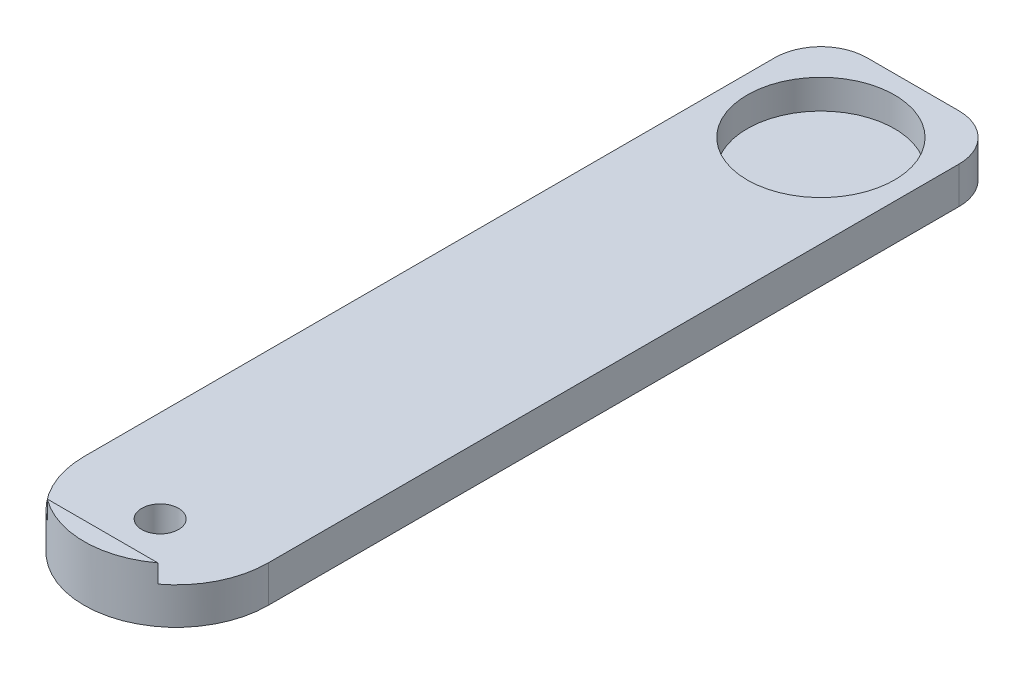
ISO-10303-21;
HEADER;
FILE_DESCRIPTION(('STEP AP214'),'2;1');
FILE_NAME('part.step','',(''),(''),'','','');
FILE_SCHEMA(('AUTOMOTIVE_DESIGN { 1 0 10303 214 1 1 1 1 }'));
ENDSEC;
DATA;
#1=APPLICATION_CONTEXT('core data for automotive mechanical design processes');
#2=APPLICATION_PROTOCOL_DEFINITION('international standard','automotive_design',2000,#1);
#3=PRODUCT_CONTEXT('',#1,'mechanical');
#4=PRODUCT('Part','Part','',(#3));
#5=PRODUCT_RELATED_PRODUCT_CATEGORY('part','',(#4));
#6=PRODUCT_DEFINITION_FORMATION('','',#4);
#7=PRODUCT_DEFINITION_CONTEXT('part definition',#1,'design');
#8=PRODUCT_DEFINITION('design','',#6,#7);
#9=PRODUCT_DEFINITION_SHAPE('','',#8);
#10=(LENGTH_UNIT() NAMED_UNIT(*) SI_UNIT(.MILLI.,.METRE.));
#11=(NAMED_UNIT(*) PLANE_ANGLE_UNIT() SI_UNIT($,.RADIAN.));
#12=(NAMED_UNIT(*) SI_UNIT($,.STERADIAN.) SOLID_ANGLE_UNIT());
#13=UNCERTAINTY_MEASURE_WITH_UNIT(LENGTH_MEASURE(1.E-05),#10,'distance_accuracy_value','');
#14=(GEOMETRIC_REPRESENTATION_CONTEXT(3) GLOBAL_UNCERTAINTY_ASSIGNED_CONTEXT((#13)) GLOBAL_UNIT_ASSIGNED_CONTEXT((#10,
#11,#12)) REPRESENTATION_CONTEXT('',''));
#15=CARTESIAN_POINT('',(0.,0.,0.));
#16=DIRECTION('',(0.,0.,1.));
#17=DIRECTION('',(1.,0.,0.));
#18=AXIS2_PLACEMENT_3D('',#15,#16,#17);
#19=CARTESIAN_POINT('',(0.,4.,0.));
#20=DIRECTION('',(0.,-1.,0.));
#21=DIRECTION('',(0.,0.,-1.));
#22=AXIS2_PLACEMENT_3D('',#19,#20,#21);
#23=PLANE('',#22);
#24=CARTESIAN_POINT('',(0.,4.,-30.));
#25=DIRECTION('',(0.,1.,0.));
#26=DIRECTION('',(0.,0.,1.));
#27=AXIS2_PLACEMENT_3D('',#24,#25,#26);
#28=CIRCLE('',#27,8.);
#29=CARTESIAN_POINT('',(0.,4.,-22.));
#30=VERTEX_POINT('',#29);
#31=EDGE_CURVE('E135',#30,#30,#28,.T.);
#32=ORIENTED_EDGE('',*,*,#31,.F.);
#33=EDGE_LOOP('',(#32));
#34=FACE_BOUND('',#33,.T.);
#35=CARTESIAN_POINT('',(0.,4.,41.7425));
#36=DIRECTION('',(0.,1.,0.));
#37=DIRECTION('',(0.,0.,1.));
#38=AXIS2_PLACEMENT_3D('',#35,#36,#37);
#39=CIRCLE('',#38,2.);
#40=CARTESIAN_POINT('',(0.,4.,43.7425));
#41=VERTEX_POINT('',#40);
#42=EDGE_CURVE('E126',#41,#41,#39,.T.);
#43=ORIENTED_EDGE('',*,*,#42,.F.);
#44=EDGE_LOOP('',(#43));
#45=FACE_BOUND('',#44,.T.);
#46=DIRECTION('',(0.,0.,-1.));
#47=VECTOR('',#46,1.);
#48=CARTESIAN_POINT('',(10.,4.,40.));
#49=LINE('',#48,#47);
#50=CARTESIAN_POINT('',(10.,4.,40.));
#51=VERTEX_POINT('',#50);
#52=CARTESIAN_POINT('',(10.,4.,-35.));
#53=VERTEX_POINT('',#52);
#54=EDGE_CURVE('E147',#51,#53,#49,.T.);
#55=ORIENTED_EDGE('',*,*,#54,.T.);
#56=CARTESIAN_POINT('',(5.,4.,-35.));
#57=DIRECTION('',(0.,-1.,0.));
#58=DIRECTION('',(0.,0.,-1.));
#59=AXIS2_PLACEMENT_3D('',#56,#57,#58);
#60=CIRCLE('',#59,5.);
#61=CARTESIAN_POINT('',(5.,4.,-40.));
#62=VERTEX_POINT('',#61);
#63=EDGE_CURVE('E45',#53,#62,#60,.F.);
#64=ORIENTED_EDGE('',*,*,#63,.T.);
#65=DIRECTION('',(-1.,0.,0.));
#66=VECTOR('',#65,1.);
#67=CARTESIAN_POINT('',(-10.,4.,-40.));
#68=LINE('',#67,#66);
#69=CARTESIAN_POINT('',(-5.,4.,-40.));
#70=VERTEX_POINT('',#69);
#71=EDGE_CURVE('E149',#62,#70,#68,.T.);
#72=ORIENTED_EDGE('',*,*,#71,.T.);
#73=CARTESIAN_POINT('',(-5.,4.,-35.));
#74=DIRECTION('',(0.,-1.,0.));
#75=DIRECTION('',(0.,0.,-1.));
#76=AXIS2_PLACEMENT_3D('',#73,#74,#75);
#77=CIRCLE('',#76,5.);
#78=CARTESIAN_POINT('',(-10.,4.,-35.));
#79=VERTEX_POINT('',#78);
#80=EDGE_CURVE('E52',#70,#79,#77,.F.);
#81=ORIENTED_EDGE('',*,*,#80,.T.);
#82=DIRECTION('',(0.,0.,1.));
#83=VECTOR('',#82,1.);
#84=CARTESIAN_POINT('',(-10.,4.,40.));
#85=LINE('',#84,#83);
#86=CARTESIAN_POINT('',(-10.,4.,40.));
#87=VERTEX_POINT('',#86);
#88=EDGE_CURVE('E152',#79,#87,#85,.T.);
#89=ORIENTED_EDGE('',*,*,#88,.T.);
#90=CARTESIAN_POINT('',(0.,4.,40.));
#91=DIRECTION('',(0.,1.,0.));
#92=DIRECTION('',(0.,0.,1.));
#93=AXIS2_PLACEMENT_3D('',#90,#91,#92);
#94=CIRCLE('',#93,10.);
#95=CARTESIAN_POINT('',(-6.,4.,48.));
#96=VERTEX_POINT('',#95);
#97=EDGE_CURVE('E145',#87,#96,#94,.T.);
#98=ORIENTED_EDGE('',*,*,#97,.T.);
#99=DIRECTION('',(-1.,0.,0.));
#100=VECTOR('',#99,1.);
#101=CARTESIAN_POINT('',(-6.,4.,48.));
#102=LINE('',#101,#100);
#103=CARTESIAN_POINT('',(6.,4.,48.));
#104=VERTEX_POINT('',#103);
#105=EDGE_CURVE('E119',#104,#96,#102,.T.);
#106=ORIENTED_EDGE('',*,*,#105,.F.);
#107=EDGE_CURVE('E125',#104,#51,#94,.T.);
#108=ORIENTED_EDGE('',*,*,#107,.T.);
#109=EDGE_LOOP('',(#55,#64,#72,#81,#89,#98,#106,#108));
#110=FACE_BOUND('',#109,.T.);
#111=ADVANCED_FACE('F37',(#34,#45,#110),#23,.F.);
#112=CARTESIAN_POINT('',(10.,4.,40.));
#113=DIRECTION('',(-1.,0.,0.));
#114=DIRECTION('',(0.,0.,1.));
#115=AXIS2_PLACEMENT_3D('',#112,#113,#114);
#116=PLANE('',#115);
#117=DIRECTION('',(0.,0.,-1.));
#118=VECTOR('',#117,1.);
#119=CARTESIAN_POINT('',(10.,0.,40.));
#120=LINE('',#119,#118);
#121=CARTESIAN_POINT('',(10.,0.,40.));
#122=VERTEX_POINT('',#121);
#123=CARTESIAN_POINT('',(10.,0.,-35.));
#124=VERTEX_POINT('',#123);
#125=EDGE_CURVE('E144',#122,#124,#120,.T.);
#126=ORIENTED_EDGE('',*,*,#125,.T.);
#127=DIRECTION('',(0.,-1.,0.));
#128=VECTOR('',#127,1.);
#129=CARTESIAN_POINT('',(10.,4.,-35.));
#130=LINE('',#129,#128);
#131=EDGE_CURVE('E60',#124,#53,#130,.F.);
#132=ORIENTED_EDGE('',*,*,#131,.T.);
#133=ORIENTED_EDGE('',*,*,#54,.F.);
#134=DIRECTION('',(0.,-1.,0.));
#135=VECTOR('',#134,1.);
#136=CARTESIAN_POINT('',(10.,4.,40.));
#137=LINE('',#136,#135);
#138=EDGE_CURVE('E154',#51,#122,#137,.T.);
#139=ORIENTED_EDGE('',*,*,#138,.T.);
#140=EDGE_LOOP('',(#126,#132,#133,#139));
#141=FACE_BOUND('',#140,.T.);
#142=ADVANCED_FACE('F187',(#141),#116,.F.);
#143=CARTESIAN_POINT('',(-10.,4.,-40.));
#144=DIRECTION('',(0.,0.,1.));
#145=DIRECTION('',(1.,0.,0.));
#146=AXIS2_PLACEMENT_3D('',#143,#144,#145);
#147=PLANE('',#146);
#148=ORIENTED_EDGE('',*,*,#71,.F.);
#149=DIRECTION('',(0.,-1.,0.));
#150=VECTOR('',#149,1.);
#151=CARTESIAN_POINT('',(5.,4.,-40.));
#152=LINE('',#151,#150);
#153=CARTESIAN_POINT('',(5.,0.,-40.));
#154=VERTEX_POINT('',#153);
#155=EDGE_CURVE('E166',#62,#154,#152,.T.);
#156=ORIENTED_EDGE('',*,*,#155,.T.);
#157=DIRECTION('',(-1.,0.,0.));
#158=VECTOR('',#157,1.);
#159=CARTESIAN_POINT('',(-10.,0.,-40.));
#160=LINE('',#159,#158);
#161=CARTESIAN_POINT('',(-5.,0.,-40.));
#162=VERTEX_POINT('',#161);
#163=EDGE_CURVE('E156',#154,#162,#160,.T.);
#164=ORIENTED_EDGE('',*,*,#163,.T.);
#165=DIRECTION('',(0.,-1.,0.));
#166=VECTOR('',#165,1.);
#167=CARTESIAN_POINT('',(-5.,4.,-40.));
#168=LINE('',#167,#166);
#169=EDGE_CURVE('E164',#162,#70,#168,.F.);
#170=ORIENTED_EDGE('',*,*,#169,.T.);
#171=EDGE_LOOP('',(#148,#156,#164,#170));
#172=FACE_BOUND('',#171,.T.);
#173=ADVANCED_FACE('F179',(#172),#147,.F.);
#174=CARTESIAN_POINT('',(-10.,4.,40.));
#175=DIRECTION('',(1.,0.,0.));
#176=DIRECTION('',(0.,0.,-1.));
#177=AXIS2_PLACEMENT_3D('',#174,#175,#176);
#178=PLANE('',#177);
#179=ORIENTED_EDGE('',*,*,#88,.F.);
#180=DIRECTION('',(0.,-1.,0.));
#181=VECTOR('',#180,1.);
#182=CARTESIAN_POINT('',(-10.,4.,-35.));
#183=LINE('',#182,#181);
#184=CARTESIAN_POINT('',(-10.,0.,-35.));
#185=VERTEX_POINT('',#184);
#186=EDGE_CURVE('E11',#79,#185,#183,.T.);
#187=ORIENTED_EDGE('',*,*,#186,.T.);
#188=DIRECTION('',(0.,0.,1.));
#189=VECTOR('',#188,1.);
#190=CARTESIAN_POINT('',(-10.,0.,40.));
#191=LINE('',#190,#189);
#192=CARTESIAN_POINT('',(-10.,0.,40.));
#193=VERTEX_POINT('',#192);
#194=EDGE_CURVE('E150',#185,#193,#191,.T.);
#195=ORIENTED_EDGE('',*,*,#194,.T.);
#196=DIRECTION('',(0.,-1.,0.));
#197=VECTOR('',#196,1.);
#198=CARTESIAN_POINT('',(-10.,4.,40.));
#199=LINE('',#198,#197);
#200=EDGE_CURVE('E162',#87,#193,#199,.T.);
#201=ORIENTED_EDGE('',*,*,#200,.F.);
#202=EDGE_LOOP('',(#179,#187,#195,#201));
#203=FACE_BOUND('',#202,.T.);
#204=ADVANCED_FACE('F192',(#203),#178,.F.);
#205=CARTESIAN_POINT('',(0.,0.,0.));
#206=DIRECTION('',(0.,-1.,0.));
#207=DIRECTION('',(0.,0.,-1.));
#208=AXIS2_PLACEMENT_3D('',#205,#206,#207);
#209=PLANE('',#208);
#210=CARTESIAN_POINT('',(0.,0.,41.7425));
#211=DIRECTION('',(0.,1.,0.));
#212=DIRECTION('',(0.,0.,1.));
#213=AXIS2_PLACEMENT_3D('',#210,#211,#212);
#214=CIRCLE('',#213,2.);
#215=CARTESIAN_POINT('',(0.,0.,43.7425));
#216=VERTEX_POINT('',#215);
#217=EDGE_CURVE('E129',#216,#216,#214,.T.);
#218=ORIENTED_EDGE('',*,*,#217,.T.);
#219=EDGE_LOOP('',(#218));
#220=FACE_BOUND('',#219,.T.);
#221=ORIENTED_EDGE('',*,*,#163,.F.);
#222=CARTESIAN_POINT('',(5.,0.,-35.));
#223=DIRECTION('',(0.,-1.,0.));
#224=DIRECTION('',(0.,0.,-1.));
#225=AXIS2_PLACEMENT_3D('',#222,#223,#224);
#226=CIRCLE('',#225,5.);
#227=EDGE_CURVE('E171',#154,#124,#226,.T.);
#228=ORIENTED_EDGE('',*,*,#227,.T.);
#229=ORIENTED_EDGE('',*,*,#125,.F.);
#230=CARTESIAN_POINT('',(0.,0.,40.));
#231=DIRECTION('',(0.,1.,0.));
#232=DIRECTION('',(0.,0.,1.));
#233=AXIS2_PLACEMENT_3D('',#230,#231,#232);
#234=CIRCLE('',#233,10.);
#235=EDGE_CURVE('E142',#193,#122,#234,.T.);
#236=ORIENTED_EDGE('',*,*,#235,.F.);
#237=ORIENTED_EDGE('',*,*,#194,.F.);
#238=CARTESIAN_POINT('',(-5.,0.,-35.));
#239=DIRECTION('',(0.,-1.,0.));
#240=DIRECTION('',(0.,0.,-1.));
#241=AXIS2_PLACEMENT_3D('',#238,#239,#240);
#242=CIRCLE('',#241,5.);
#243=EDGE_CURVE('E169',#185,#162,#242,.T.);
#244=ORIENTED_EDGE('',*,*,#243,.T.);
#245=EDGE_LOOP('',(#221,#228,#229,#236,#237,#244));
#246=FACE_BOUND('',#245,.T.);
#247=ADVANCED_FACE('F185',(#220,#246),#209,.T.);
#248=CARTESIAN_POINT('',(0.,0.,40.));
#249=DIRECTION('',(0.,1.,0.));
#250=DIRECTION('',(0.,0.,1.));
#251=AXIS2_PLACEMENT_3D('',#248,#249,#250);
#252=CYLINDRICAL_SURFACE('',#251,10.);
#253=ORIENTED_EDGE('',*,*,#200,.T.);
#254=ORIENTED_EDGE('',*,*,#235,.T.);
#255=ORIENTED_EDGE('',*,*,#138,.F.);
#256=ORIENTED_EDGE('',*,*,#107,.F.);
#257=DIRECTION('',(0.,-1.,0.));
#258=VECTOR('',#257,1.);
#259=CARTESIAN_POINT('',(6.,6.,48.));
#260=LINE('',#259,#258);
#261=CARTESIAN_POINT('',(6.,6.,48.));
#262=VERTEX_POINT('',#261);
#263=EDGE_CURVE('E110',#262,#104,#260,.T.);
#264=ORIENTED_EDGE('',*,*,#263,.F.);
#265=CARTESIAN_POINT('',(0.,6.,40.));
#266=DIRECTION('',(0.,1.,0.));
#267=DIRECTION('',(0.,0.,1.));
#268=AXIS2_PLACEMENT_3D('',#265,#266,#267);
#269=CIRCLE('',#268,10.);
#270=CARTESIAN_POINT('',(-6.,6.,48.));
#271=VERTEX_POINT('',#270);
#272=EDGE_CURVE('E115',#271,#262,#269,.T.);
#273=ORIENTED_EDGE('',*,*,#272,.F.);
#274=DIRECTION('',(0.,-1.,0.));
#275=VECTOR('',#274,1.);
#276=CARTESIAN_POINT('',(-6.,6.,48.));
#277=LINE('',#276,#275);
#278=EDGE_CURVE('E112',#271,#96,#277,.T.);
#279=ORIENTED_EDGE('',*,*,#278,.T.);
#280=ORIENTED_EDGE('',*,*,#97,.F.);
#281=EDGE_LOOP('',(#253,#254,#255,#256,#264,#273,#279,#280));
#282=FACE_BOUND('',#281,.T.);
#283=ADVANCED_FACE('F123',(#282),#252,.T.);
#284=CARTESIAN_POINT('',(0.,0.825,-30.));
#285=DIRECTION('',(0.,1.,0.));
#286=DIRECTION('',(0.,0.,1.));
#287=AXIS2_PLACEMENT_3D('',#284,#285,#286);
#288=CYLINDRICAL_SURFACE('',#287,8.);
#289=CARTESIAN_POINT('',(0.,0.825,-30.));
#290=DIRECTION('',(0.,1.,0.));
#291=DIRECTION('',(0.,0.,1.));
#292=AXIS2_PLACEMENT_3D('',#289,#290,#291);
#293=CIRCLE('',#292,8.);
#294=CARTESIAN_POINT('',(0.,0.825,-22.));
#295=VERTEX_POINT('',#294);
#296=EDGE_CURVE('E137',#295,#295,#293,.T.);
#297=ORIENTED_EDGE('',*,*,#296,.F.);
#298=EDGE_LOOP('',(#297));
#299=FACE_BOUND('',#298,.T.);
#300=ORIENTED_EDGE('',*,*,#31,.T.);
#301=EDGE_LOOP('',(#300));
#302=FACE_BOUND('',#301,.T.);
#303=ADVANCED_FACE('F284',(#299,#302),#288,.F.);
#304=CARTESIAN_POINT('',(0.,0.825,-30.));
#305=DIRECTION('',(0.,1.,0.));
#306=DIRECTION('',(0.,0.,1.));
#307=AXIS2_PLACEMENT_3D('',#304,#305,#306);
#308=PLANE('',#307);
#309=ORIENTED_EDGE('',*,*,#296,.T.);
#310=EDGE_LOOP('',(#309));
#311=FACE_BOUND('',#310,.T.);
#312=ADVANCED_FACE('F274',(#311),#308,.T.);
#313=CARTESIAN_POINT('',(0.,0.,41.7425));
#314=DIRECTION('',(0.,1.,0.));
#315=DIRECTION('',(0.,0.,1.));
#316=AXIS2_PLACEMENT_3D('',#313,#314,#315);
#317=CYLINDRICAL_SURFACE('',#316,2.);
#318=ORIENTED_EDGE('',*,*,#217,.F.);
#319=EDGE_LOOP('',(#318));
#320=FACE_BOUND('',#319,.T.);
#321=ORIENTED_EDGE('',*,*,#42,.T.);
#322=EDGE_LOOP('',(#321));
#323=FACE_BOUND('',#322,.T.);
#324=ADVANCED_FACE('F258',(#320,#323),#317,.F.);
#325=CARTESIAN_POINT('',(-6.,6.,48.));
#326=DIRECTION('',(0.,0.,1.));
#327=DIRECTION('',(1.,0.,0.));
#328=AXIS2_PLACEMENT_3D('',#325,#326,#327);
#329=PLANE('',#328);
#330=ORIENTED_EDGE('',*,*,#105,.T.);
#331=ORIENTED_EDGE('',*,*,#278,.F.);
#332=DIRECTION('',(-1.,0.,0.));
#333=VECTOR('',#332,1.);
#334=CARTESIAN_POINT('',(-6.,6.,48.));
#335=LINE('',#334,#333);
#336=EDGE_CURVE('E105',#262,#271,#335,.T.);
#337=ORIENTED_EDGE('',*,*,#336,.F.);
#338=ORIENTED_EDGE('',*,*,#263,.T.);
#339=EDGE_LOOP('',(#330,#331,#337,#338));
#340=FACE_BOUND('',#339,.T.);
#341=ADVANCED_FACE('F108',(#340),#329,.F.);
#342=CARTESIAN_POINT('',(0.,6.,40.));
#343=DIRECTION('',(0.,1.,0.));
#344=DIRECTION('',(0.,0.,1.));
#345=AXIS2_PLACEMENT_3D('',#342,#343,#344);
#346=PLANE('',#345);
#347=ORIENTED_EDGE('',*,*,#272,.T.);
#348=ORIENTED_EDGE('',*,*,#336,.T.);
#349=EDGE_LOOP('',(#347,#348));
#350=FACE_BOUND('',#349,.T.);
#351=ADVANCED_FACE('F117',(#350),#346,.T.);
#352=CARTESIAN_POINT('',(5.,4.,-35.));
#353=DIRECTION('',(0.,-1.,0.));
#354=DIRECTION('',(0.,0.,-1.));
#355=AXIS2_PLACEMENT_3D('',#352,#353,#354);
#356=CYLINDRICAL_SURFACE('',#355,5.);
#357=ORIENTED_EDGE('',*,*,#63,.F.);
#358=ORIENTED_EDGE('',*,*,#131,.F.);
#359=ORIENTED_EDGE('',*,*,#227,.F.);
#360=ORIENTED_EDGE('',*,*,#155,.F.);
#361=EDGE_LOOP('',(#357,#358,#359,#360));
#362=FACE_BOUND('',#361,.T.);
#363=ADVANCED_FACE('F182',(#362),#356,.T.);
#364=CARTESIAN_POINT('',(-5.,4.,-35.));
#365=DIRECTION('',(0.,-1.,0.));
#366=DIRECTION('',(0.,0.,-1.));
#367=AXIS2_PLACEMENT_3D('',#364,#365,#366);
#368=CYLINDRICAL_SURFACE('',#367,5.);
#369=ORIENTED_EDGE('',*,*,#80,.F.);
#370=ORIENTED_EDGE('',*,*,#169,.F.);
#371=ORIENTED_EDGE('',*,*,#243,.F.);
#372=ORIENTED_EDGE('',*,*,#186,.F.);
#373=EDGE_LOOP('',(#369,#370,#371,#372));
#374=FACE_BOUND('',#373,.T.);
#375=ADVANCED_FACE('F39',(#374),#368,.T.);
#376=CLOSED_SHELL('',(#111,#142,#173,#204,#247,#283,#303,#312,#324,#341,#351,#363,#375));
#377=MANIFOLD_SOLID_BREP('B2',#376);
#378=ADVANCED_BREP_SHAPE_REPRESENTATION('',(#18,#377),#14);
#379=SHAPE_DEFINITION_REPRESENTATION(#9,#378);
ENDSEC;
END-ISO-10303-21;
